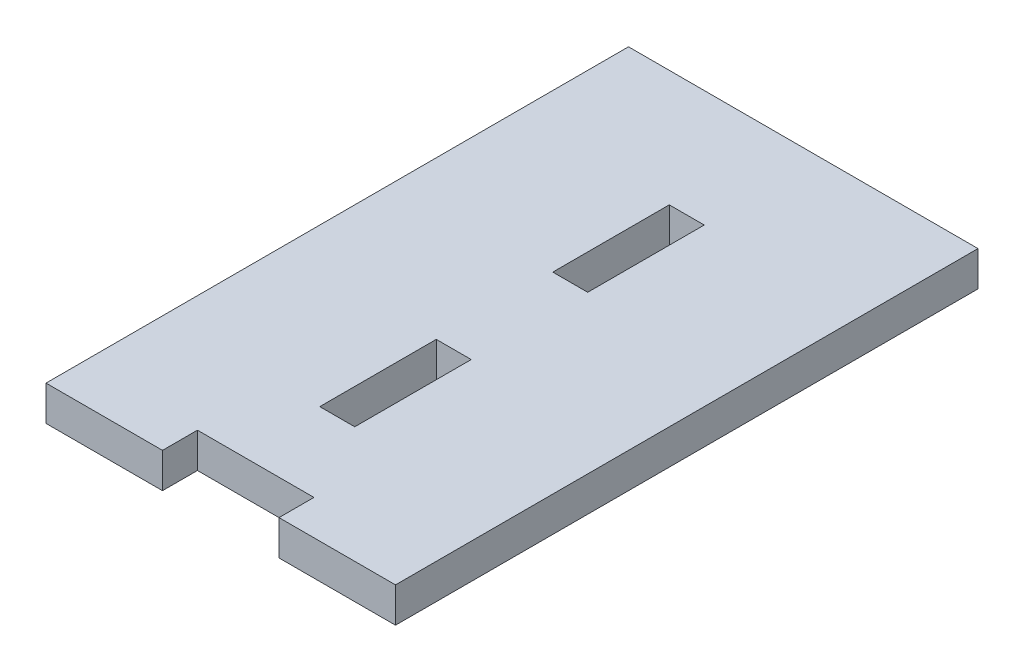
ISO-10303-21;
HEADER;
FILE_DESCRIPTION(('STEP AP214'),'2;1');
FILE_NAME('part.step','',(''),(''),'','','');
FILE_SCHEMA(('AUTOMOTIVE_DESIGN { 1 0 10303 214 1 1 1 1 }'));
ENDSEC;
DATA;
#1=APPLICATION_CONTEXT('core data for automotive mechanical design processes');
#2=APPLICATION_PROTOCOL_DEFINITION('international standard','automotive_design',2000,#1);
#3=PRODUCT_CONTEXT('',#1,'mechanical');
#4=PRODUCT('Part','Part','',(#3));
#5=PRODUCT_RELATED_PRODUCT_CATEGORY('part','',(#4));
#6=PRODUCT_DEFINITION_FORMATION('','',#4);
#7=PRODUCT_DEFINITION_CONTEXT('part definition',#1,'design');
#8=PRODUCT_DEFINITION('design','',#6,#7);
#9=PRODUCT_DEFINITION_SHAPE('','',#8);
#10=(LENGTH_UNIT() NAMED_UNIT(*) SI_UNIT(.MILLI.,.METRE.));
#11=(NAMED_UNIT(*) PLANE_ANGLE_UNIT() SI_UNIT($,.RADIAN.));
#12=(NAMED_UNIT(*) SI_UNIT($,.STERADIAN.) SOLID_ANGLE_UNIT());
#13=UNCERTAINTY_MEASURE_WITH_UNIT(LENGTH_MEASURE(1.E-05),#10,'distance_accuracy_value','');
#14=(GEOMETRIC_REPRESENTATION_CONTEXT(3) GLOBAL_UNCERTAINTY_ASSIGNED_CONTEXT((#13)) GLOBAL_UNIT_ASSIGNED_CONTEXT((#10,
#11,#12)) REPRESENTATION_CONTEXT('',''));
#15=CARTESIAN_POINT('',(0.,0.,0.));
#16=DIRECTION('',(0.,0.,1.));
#17=DIRECTION('',(1.,0.,0.));
#18=AXIS2_PLACEMENT_3D('',#15,#16,#17);
#19=CARTESIAN_POINT('',(0.,3.,0.));
#20=DIRECTION('',(0.,-1.,0.));
#21=DIRECTION('',(0.,0.,-1.));
#22=AXIS2_PLACEMENT_3D('',#19,#20,#21);
#23=PLANE('',#22);
#24=DIRECTION('',(0.,0.,-1.));
#25=VECTOR('',#24,1.);
#26=CARTESIAN_POINT('',(21.5,3.,-10.));
#27=LINE('',#26,#25);
#28=CARTESIAN_POINT('',(21.5,3.,-10.));
#29=VERTEX_POINT('',#28);
#30=CARTESIAN_POINT('',(21.5,3.,-20.));
#31=VERTEX_POINT('',#30);
#32=EDGE_CURVE('E182',#29,#31,#27,.T.);
#33=ORIENTED_EDGE('',*,*,#32,.F.);
#34=DIRECTION('',(1.,0.,0.));
#35=VECTOR('',#34,1.);
#36=CARTESIAN_POINT('',(18.5,3.,-10.));
#37=LINE('',#36,#35);
#38=CARTESIAN_POINT('',(18.5,3.,-10.));
#39=VERTEX_POINT('',#38);
#40=EDGE_CURVE('E190',#39,#29,#37,.T.);
#41=ORIENTED_EDGE('',*,*,#40,.F.);
#42=DIRECTION('',(0.,0.,1.));
#43=VECTOR('',#42,1.);
#44=CARTESIAN_POINT('',(18.5,3.,-10.));
#45=LINE('',#44,#43);
#46=CARTESIAN_POINT('',(18.5,3.,-20.));
#47=VERTEX_POINT('',#46);
#48=EDGE_CURVE('E187',#47,#39,#45,.T.);
#49=ORIENTED_EDGE('',*,*,#48,.F.);
#50=DIRECTION('',(-1.,0.,0.));
#51=VECTOR('',#50,1.);
#52=CARTESIAN_POINT('',(21.5,3.,-20.));
#53=LINE('',#52,#51);
#54=EDGE_CURVE('E184',#31,#47,#53,.T.);
#55=ORIENTED_EDGE('',*,*,#54,.F.);
#56=EDGE_LOOP('',(#33,#41,#49,#55));
#57=FACE_BOUND('',#56,.T.);
#58=DIRECTION('',(1.,0.,0.));
#59=VECTOR('',#58,1.);
#60=CARTESIAN_POINT('',(15.,3.,-3.));
#61=LINE('',#60,#59);
#62=CARTESIAN_POINT('',(15.,3.,-3.));
#63=VERTEX_POINT('',#62);
#64=CARTESIAN_POINT('',(25.,3.,-3.));
#65=VERTEX_POINT('',#64);
#66=EDGE_CURVE('E213',#63,#65,#61,.T.);
#67=ORIENTED_EDGE('',*,*,#66,.T.);
#68=DIRECTION('',(0.,0.,1.));
#69=VECTOR('',#68,1.);
#70=CARTESIAN_POINT('',(25.,3.,-3.));
#71=LINE('',#70,#69);
#72=CARTESIAN_POINT('',(25.,3.,0.));
#73=VERTEX_POINT('',#72);
#74=EDGE_CURVE('E216',#65,#73,#71,.T.);
#75=ORIENTED_EDGE('',*,*,#74,.T.);
#76=DIRECTION('',(1.,0.,0.));
#77=VECTOR('',#76,1.);
#78=CARTESIAN_POINT('',(25.,3.,0.));
#79=LINE('',#78,#77);
#80=CARTESIAN_POINT('',(35.,3.,0.));
#81=VERTEX_POINT('',#80);
#82=EDGE_CURVE('E219',#73,#81,#79,.T.);
#83=ORIENTED_EDGE('',*,*,#82,.T.);
#84=DIRECTION('',(0.,0.,-1.));
#85=VECTOR('',#84,1.);
#86=CARTESIAN_POINT('',(35.,3.,0.));
#87=LINE('',#86,#85);
#88=CARTESIAN_POINT('',(35.,3.,-50.));
#89=VERTEX_POINT('',#88);
#90=EDGE_CURVE('E221',#81,#89,#87,.T.);
#91=ORIENTED_EDGE('',*,*,#90,.T.);
#92=DIRECTION('',(-1.,0.,0.));
#93=VECTOR('',#92,1.);
#94=CARTESIAN_POINT('',(35.,3.,-50.));
#95=LINE('',#94,#93);
#96=CARTESIAN_POINT('',(5.,3.,-50.));
#97=VERTEX_POINT('',#96);
#98=EDGE_CURVE('E223',#89,#97,#95,.T.);
#99=ORIENTED_EDGE('',*,*,#98,.T.);
#100=DIRECTION('',(0.,0.,1.));
#101=VECTOR('',#100,1.);
#102=CARTESIAN_POINT('',(5.,3.,0.));
#103=LINE('',#102,#101);
#104=CARTESIAN_POINT('',(5.,3.,0.));
#105=VERTEX_POINT('',#104);
#106=EDGE_CURVE('E225',#97,#105,#103,.T.);
#107=ORIENTED_EDGE('',*,*,#106,.T.);
#108=DIRECTION('',(1.,0.,0.));
#109=VECTOR('',#108,1.);
#110=CARTESIAN_POINT('',(15.,3.,0.));
#111=LINE('',#110,#109);
#112=CARTESIAN_POINT('',(15.,3.,0.));
#113=VERTEX_POINT('',#112);
#114=EDGE_CURVE('E227',#105,#113,#111,.T.);
#115=ORIENTED_EDGE('',*,*,#114,.T.);
#116=DIRECTION('',(0.,0.,-1.));
#117=VECTOR('',#116,1.);
#118=CARTESIAN_POINT('',(15.,3.,-3.));
#119=LINE('',#118,#117);
#120=EDGE_CURVE('E229',#113,#63,#119,.T.);
#121=ORIENTED_EDGE('',*,*,#120,.T.);
#122=EDGE_LOOP('',(#67,#75,#83,#91,#99,#107,#115,#121));
#123=FACE_BOUND('',#122,.T.);
#124=DIRECTION('',(0.,0.,-1.));
#125=VECTOR('',#124,1.);
#126=CARTESIAN_POINT('',(21.5,3.,-40.));
#127=LINE('',#126,#125);
#128=CARTESIAN_POINT('',(21.5,3.,-30.));
#129=VERTEX_POINT('',#128);
#130=CARTESIAN_POINT('',(21.5,3.,-40.));
#131=VERTEX_POINT('',#130);
#132=EDGE_CURVE('E146',#129,#131,#127,.T.);
#133=ORIENTED_EDGE('',*,*,#132,.F.);
#134=DIRECTION('',(1.,0.,0.));
#135=VECTOR('',#134,1.);
#136=CARTESIAN_POINT('',(21.5,3.,-30.));
#137=LINE('',#136,#135);
#138=CARTESIAN_POINT('',(18.5,3.,-30.));
#139=VERTEX_POINT('',#138);
#140=EDGE_CURVE('E168',#139,#129,#137,.T.);
#141=ORIENTED_EDGE('',*,*,#140,.F.);
#142=DIRECTION('',(0.,0.,1.));
#143=VECTOR('',#142,1.);
#144=CARTESIAN_POINT('',(18.5,3.,-40.));
#145=LINE('',#144,#143);
#146=CARTESIAN_POINT('',(18.5,3.,-40.));
#147=VERTEX_POINT('',#146);
#148=EDGE_CURVE('E166',#147,#139,#145,.T.);
#149=ORIENTED_EDGE('',*,*,#148,.F.);
#150=DIRECTION('',(-1.,0.,0.));
#151=VECTOR('',#150,1.);
#152=CARTESIAN_POINT('',(18.5,3.,-40.));
#153=LINE('',#152,#151);
#154=EDGE_CURVE('E154',#131,#147,#153,.T.);
#155=ORIENTED_EDGE('',*,*,#154,.F.);
#156=EDGE_LOOP('',(#133,#141,#149,#155));
#157=FACE_BOUND('',#156,.T.);
#158=ADVANCED_FACE('F33',(#57,#123,#157),#23,.F.);
#159=CARTESIAN_POINT('',(0.,0.,0.));
#160=DIRECTION('',(0.,-1.,0.));
#161=DIRECTION('',(0.,0.,-1.));
#162=AXIS2_PLACEMENT_3D('',#159,#160,#161);
#163=PLANE('',#162);
#164=DIRECTION('',(1.,0.,0.));
#165=VECTOR('',#164,1.);
#166=CARTESIAN_POINT('',(15.,0.,-3.));
#167=LINE('',#166,#165);
#168=CARTESIAN_POINT('',(15.,0.,-3.));
#169=VERTEX_POINT('',#168);
#170=CARTESIAN_POINT('',(25.,0.,-3.));
#171=VERTEX_POINT('',#170);
#172=EDGE_CURVE('E212',#169,#171,#167,.T.);
#173=ORIENTED_EDGE('',*,*,#172,.F.);
#174=DIRECTION('',(0.,0.,-1.));
#175=VECTOR('',#174,1.);
#176=CARTESIAN_POINT('',(15.,0.,-3.));
#177=LINE('',#176,#175);
#178=CARTESIAN_POINT('',(15.,0.,0.));
#179=VERTEX_POINT('',#178);
#180=EDGE_CURVE('E217',#179,#169,#177,.T.);
#181=ORIENTED_EDGE('',*,*,#180,.F.);
#182=DIRECTION('',(1.,0.,0.));
#183=VECTOR('',#182,1.);
#184=CARTESIAN_POINT('',(15.,0.,0.));
#185=LINE('',#184,#183);
#186=CARTESIAN_POINT('',(5.,0.,0.));
#187=VERTEX_POINT('',#186);
#188=EDGE_CURVE('E244',#187,#179,#185,.T.);
#189=ORIENTED_EDGE('',*,*,#188,.F.);
#190=DIRECTION('',(0.,0.,1.));
#191=VECTOR('',#190,1.);
#192=CARTESIAN_POINT('',(5.,0.,0.));
#193=LINE('',#192,#191);
#194=CARTESIAN_POINT('',(5.,0.,-50.));
#195=VERTEX_POINT('',#194);
#196=EDGE_CURVE('E242',#195,#187,#193,.T.);
#197=ORIENTED_EDGE('',*,*,#196,.F.);
#198=DIRECTION('',(-1.,0.,0.));
#199=VECTOR('',#198,1.);
#200=CARTESIAN_POINT('',(35.,0.,-50.));
#201=LINE('',#200,#199);
#202=CARTESIAN_POINT('',(35.,0.,-50.));
#203=VERTEX_POINT('',#202);
#204=EDGE_CURVE('E240',#203,#195,#201,.T.);
#205=ORIENTED_EDGE('',*,*,#204,.F.);
#206=DIRECTION('',(0.,0.,-1.));
#207=VECTOR('',#206,1.);
#208=CARTESIAN_POINT('',(35.,0.,0.));
#209=LINE('',#208,#207);
#210=CARTESIAN_POINT('',(35.,0.,0.));
#211=VERTEX_POINT('',#210);
#212=EDGE_CURVE('E238',#211,#203,#209,.T.);
#213=ORIENTED_EDGE('',*,*,#212,.F.);
#214=DIRECTION('',(1.,0.,0.));
#215=VECTOR('',#214,1.);
#216=CARTESIAN_POINT('',(25.,0.,0.));
#217=LINE('',#216,#215);
#218=CARTESIAN_POINT('',(25.,0.,0.));
#219=VERTEX_POINT('',#218);
#220=EDGE_CURVE('E236',#219,#211,#217,.T.);
#221=ORIENTED_EDGE('',*,*,#220,.F.);
#222=DIRECTION('',(0.,0.,1.));
#223=VECTOR('',#222,1.);
#224=CARTESIAN_POINT('',(25.,0.,-3.));
#225=LINE('',#224,#223);
#226=EDGE_CURVE('E234',#171,#219,#225,.T.);
#227=ORIENTED_EDGE('',*,*,#226,.F.);
#228=EDGE_LOOP('',(#173,#181,#189,#197,#205,#213,#221,#227));
#229=FACE_BOUND('',#228,.T.);
#230=DIRECTION('',(1.,0.,0.));
#231=VECTOR('',#230,1.);
#232=CARTESIAN_POINT('',(18.5,0.,-10.));
#233=LINE('',#232,#231);
#234=CARTESIAN_POINT('',(18.5,0.,-10.));
#235=VERTEX_POINT('',#234);
#236=CARTESIAN_POINT('',(21.5,0.,-10.));
#237=VERTEX_POINT('',#236);
#238=EDGE_CURVE('E185',#235,#237,#233,.T.);
#239=ORIENTED_EDGE('',*,*,#238,.T.);
#240=DIRECTION('',(0.,0.,-1.));
#241=VECTOR('',#240,1.);
#242=CARTESIAN_POINT('',(21.5,0.,-10.));
#243=LINE('',#242,#241);
#244=CARTESIAN_POINT('',(21.5,0.,-20.));
#245=VERTEX_POINT('',#244);
#246=EDGE_CURVE('E162',#237,#245,#243,.T.);
#247=ORIENTED_EDGE('',*,*,#246,.T.);
#248=DIRECTION('',(-1.,0.,0.));
#249=VECTOR('',#248,1.);
#250=CARTESIAN_POINT('',(21.5,0.,-20.));
#251=LINE('',#250,#249);
#252=CARTESIAN_POINT('',(18.5,0.,-20.));
#253=VERTEX_POINT('',#252);
#254=EDGE_CURVE('E195',#245,#253,#251,.T.);
#255=ORIENTED_EDGE('',*,*,#254,.T.);
#256=DIRECTION('',(0.,0.,1.));
#257=VECTOR('',#256,1.);
#258=CARTESIAN_POINT('',(18.5,0.,-10.));
#259=LINE('',#258,#257);
#260=EDGE_CURVE('E198',#253,#235,#259,.T.);
#261=ORIENTED_EDGE('',*,*,#260,.T.);
#262=EDGE_LOOP('',(#239,#247,#255,#261));
#263=FACE_BOUND('',#262,.T.);
#264=DIRECTION('',(1.,0.,0.));
#265=VECTOR('',#264,1.);
#266=CARTESIAN_POINT('',(21.5,0.,-30.));
#267=LINE('',#266,#265);
#268=CARTESIAN_POINT('',(18.5,0.,-30.));
#269=VERTEX_POINT('',#268);
#270=CARTESIAN_POINT('',(21.5,0.,-30.));
#271=VERTEX_POINT('',#270);
#272=EDGE_CURVE('E155',#269,#271,#267,.T.);
#273=ORIENTED_EDGE('',*,*,#272,.T.);
#274=DIRECTION('',(0.,0.,-1.));
#275=VECTOR('',#274,1.);
#276=CARTESIAN_POINT('',(21.5,0.,-40.));
#277=LINE('',#276,#275);
#278=CARTESIAN_POINT('',(21.5,0.,-40.));
#279=VERTEX_POINT('',#278);
#280=EDGE_CURVE('E56',#271,#279,#277,.T.);
#281=ORIENTED_EDGE('',*,*,#280,.T.);
#282=DIRECTION('',(-1.,0.,0.));
#283=VECTOR('',#282,1.);
#284=CARTESIAN_POINT('',(18.5,0.,-40.));
#285=LINE('',#284,#283);
#286=CARTESIAN_POINT('',(18.5,0.,-40.));
#287=VERTEX_POINT('',#286);
#288=EDGE_CURVE('E161',#279,#287,#285,.T.);
#289=ORIENTED_EDGE('',*,*,#288,.T.);
#290=DIRECTION('',(0.,0.,1.));
#291=VECTOR('',#290,1.);
#292=CARTESIAN_POINT('',(18.5,0.,-40.));
#293=LINE('',#292,#291);
#294=EDGE_CURVE('E174',#287,#269,#293,.T.);
#295=ORIENTED_EDGE('',*,*,#294,.T.);
#296=EDGE_LOOP('',(#273,#281,#289,#295));
#297=FACE_BOUND('',#296,.T.);
#298=ADVANCED_FACE('F274',(#229,#263,#297),#163,.T.);
#299=CARTESIAN_POINT('',(15.,3.,-3.));
#300=DIRECTION('',(0.,0.,-1.));
#301=DIRECTION('',(-1.,0.,0.));
#302=AXIS2_PLACEMENT_3D('',#299,#300,#301);
#303=PLANE('',#302);
#304=ORIENTED_EDGE('',*,*,#172,.T.);
#305=DIRECTION('',(0.,-1.,0.));
#306=VECTOR('',#305,1.);
#307=CARTESIAN_POINT('',(25.,3.,-3.));
#308=LINE('',#307,#306);
#309=EDGE_CURVE('E11',#65,#171,#308,.T.);
#310=ORIENTED_EDGE('',*,*,#309,.F.);
#311=ORIENTED_EDGE('',*,*,#66,.F.);
#312=DIRECTION('',(0.,-1.,0.));
#313=VECTOR('',#312,1.);
#314=CARTESIAN_POINT('',(15.,3.,-3.));
#315=LINE('',#314,#313);
#316=EDGE_CURVE('E231',#63,#169,#315,.T.);
#317=ORIENTED_EDGE('',*,*,#316,.T.);
#318=EDGE_LOOP('',(#304,#310,#311,#317));
#319=FACE_BOUND('',#318,.T.);
#320=ADVANCED_FACE('F35',(#319),#303,.F.);
#321=CARTESIAN_POINT('',(25.,3.,-3.));
#322=DIRECTION('',(1.,0.,0.));
#323=DIRECTION('',(0.,0.,-1.));
#324=AXIS2_PLACEMENT_3D('',#321,#322,#323);
#325=PLANE('',#324);
#326=ORIENTED_EDGE('',*,*,#226,.T.);
#327=DIRECTION('',(0.,-1.,0.));
#328=VECTOR('',#327,1.);
#329=CARTESIAN_POINT('',(25.,3.,0.));
#330=LINE('',#329,#328);
#331=EDGE_CURVE('E41',#73,#219,#330,.T.);
#332=ORIENTED_EDGE('',*,*,#331,.F.);
#333=ORIENTED_EDGE('',*,*,#74,.F.);
#334=ORIENTED_EDGE('',*,*,#309,.T.);
#335=EDGE_LOOP('',(#326,#332,#333,#334));
#336=FACE_BOUND('',#335,.T.);
#337=ADVANCED_FACE('F291',(#336),#325,.F.);
#338=CARTESIAN_POINT('',(25.,3.,0.));
#339=DIRECTION('',(0.,0.,-1.));
#340=DIRECTION('',(-1.,0.,0.));
#341=AXIS2_PLACEMENT_3D('',#338,#339,#340);
#342=PLANE('',#341);
#343=ORIENTED_EDGE('',*,*,#220,.T.);
#344=DIRECTION('',(0.,-1.,0.));
#345=VECTOR('',#344,1.);
#346=CARTESIAN_POINT('',(35.,3.,0.));
#347=LINE('',#346,#345);
#348=EDGE_CURVE('E261',#81,#211,#347,.T.);
#349=ORIENTED_EDGE('',*,*,#348,.F.);
#350=ORIENTED_EDGE('',*,*,#82,.F.);
#351=ORIENTED_EDGE('',*,*,#331,.T.);
#352=EDGE_LOOP('',(#343,#349,#350,#351));
#353=FACE_BOUND('',#352,.T.);
#354=ADVANCED_FACE('F268',(#353),#342,.F.);
#355=CARTESIAN_POINT('',(35.,3.,0.));
#356=DIRECTION('',(-1.,0.,0.));
#357=DIRECTION('',(0.,0.,1.));
#358=AXIS2_PLACEMENT_3D('',#355,#356,#357);
#359=PLANE('',#358);
#360=ORIENTED_EDGE('',*,*,#212,.T.);
#361=DIRECTION('',(0.,-1.,0.));
#362=VECTOR('',#361,1.);
#363=CARTESIAN_POINT('',(35.,3.,-50.));
#364=LINE('',#363,#362);
#365=EDGE_CURVE('E258',#89,#203,#364,.T.);
#366=ORIENTED_EDGE('',*,*,#365,.F.);
#367=ORIENTED_EDGE('',*,*,#90,.F.);
#368=ORIENTED_EDGE('',*,*,#348,.T.);
#369=EDGE_LOOP('',(#360,#366,#367,#368));
#370=FACE_BOUND('',#369,.T.);
#371=ADVANCED_FACE('F280',(#370),#359,.F.);
#372=CARTESIAN_POINT('',(35.,3.,-50.));
#373=DIRECTION('',(0.,0.,1.));
#374=DIRECTION('',(1.,0.,0.));
#375=AXIS2_PLACEMENT_3D('',#372,#373,#374);
#376=PLANE('',#375);
#377=ORIENTED_EDGE('',*,*,#204,.T.);
#378=DIRECTION('',(0.,-1.,0.));
#379=VECTOR('',#378,1.);
#380=CARTESIAN_POINT('',(5.,3.,-50.));
#381=LINE('',#380,#379);
#382=EDGE_CURVE('E255',#97,#195,#381,.T.);
#383=ORIENTED_EDGE('',*,*,#382,.F.);
#384=ORIENTED_EDGE('',*,*,#98,.F.);
#385=ORIENTED_EDGE('',*,*,#365,.T.);
#386=EDGE_LOOP('',(#377,#383,#384,#385));
#387=FACE_BOUND('',#386,.T.);
#388=ADVANCED_FACE('F284',(#387),#376,.F.);
#389=CARTESIAN_POINT('',(5.,3.,0.));
#390=DIRECTION('',(1.,0.,0.));
#391=DIRECTION('',(0.,0.,-1.));
#392=AXIS2_PLACEMENT_3D('',#389,#390,#391);
#393=PLANE('',#392);
#394=ORIENTED_EDGE('',*,*,#196,.T.);
#395=DIRECTION('',(0.,-1.,0.));
#396=VECTOR('',#395,1.);
#397=CARTESIAN_POINT('',(5.,3.,0.));
#398=LINE('',#397,#396);
#399=EDGE_CURVE('E252',#105,#187,#398,.T.);
#400=ORIENTED_EDGE('',*,*,#399,.F.);
#401=ORIENTED_EDGE('',*,*,#106,.F.);
#402=ORIENTED_EDGE('',*,*,#382,.T.);
#403=EDGE_LOOP('',(#394,#400,#401,#402));
#404=FACE_BOUND('',#403,.T.);
#405=ADVANCED_FACE('F304',(#404),#393,.F.);
#406=CARTESIAN_POINT('',(15.,3.,0.));
#407=DIRECTION('',(0.,0.,-1.));
#408=DIRECTION('',(-1.,0.,0.));
#409=AXIS2_PLACEMENT_3D('',#406,#407,#408);
#410=PLANE('',#409);
#411=ORIENTED_EDGE('',*,*,#188,.T.);
#412=DIRECTION('',(0.,-1.,0.));
#413=VECTOR('',#412,1.);
#414=CARTESIAN_POINT('',(15.,3.,0.));
#415=LINE('',#414,#413);
#416=EDGE_CURVE('E249',#113,#179,#415,.T.);
#417=ORIENTED_EDGE('',*,*,#416,.F.);
#418=ORIENTED_EDGE('',*,*,#114,.F.);
#419=ORIENTED_EDGE('',*,*,#399,.T.);
#420=EDGE_LOOP('',(#411,#417,#418,#419));
#421=FACE_BOUND('',#420,.T.);
#422=ADVANCED_FACE('F302',(#421),#410,.F.);
#423=CARTESIAN_POINT('',(15.,3.,-3.));
#424=DIRECTION('',(-1.,0.,0.));
#425=DIRECTION('',(0.,0.,1.));
#426=AXIS2_PLACEMENT_3D('',#423,#424,#425);
#427=PLANE('',#426);
#428=ORIENTED_EDGE('',*,*,#180,.T.);
#429=ORIENTED_EDGE('',*,*,#316,.F.);
#430=ORIENTED_EDGE('',*,*,#120,.F.);
#431=ORIENTED_EDGE('',*,*,#416,.T.);
#432=EDGE_LOOP('',(#428,#429,#430,#431));
#433=FACE_BOUND('',#432,.T.);
#434=ADVANCED_FACE('F297',(#433),#427,.F.);
#435=CARTESIAN_POINT('',(21.5,3.,-10.));
#436=DIRECTION('',(-1.,0.,0.));
#437=DIRECTION('',(0.,0.,1.));
#438=AXIS2_PLACEMENT_3D('',#435,#436,#437);
#439=PLANE('',#438);
#440=ORIENTED_EDGE('',*,*,#246,.F.);
#441=DIRECTION('',(0.,-1.,0.));
#442=VECTOR('',#441,1.);
#443=CARTESIAN_POINT('',(21.5,3.,-10.));
#444=LINE('',#443,#442);
#445=EDGE_CURVE('E192',#29,#237,#444,.T.);
#446=ORIENTED_EDGE('',*,*,#445,.F.);
#447=ORIENTED_EDGE('',*,*,#32,.T.);
#448=DIRECTION('',(0.,-1.,0.));
#449=VECTOR('',#448,1.);
#450=CARTESIAN_POINT('',(21.5,3.,-20.));
#451=LINE('',#450,#449);
#452=EDGE_CURVE('E209',#31,#245,#451,.T.);
#453=ORIENTED_EDGE('',*,*,#452,.T.);
#454=EDGE_LOOP('',(#440,#446,#447,#453));
#455=FACE_BOUND('',#454,.T.);
#456=ADVANCED_FACE('F322',(#455),#439,.T.);
#457=CARTESIAN_POINT('',(21.5,3.,-20.));
#458=DIRECTION('',(0.,0.,1.));
#459=DIRECTION('',(1.,0.,0.));
#460=AXIS2_PLACEMENT_3D('',#457,#458,#459);
#461=PLANE('',#460);
#462=ORIENTED_EDGE('',*,*,#254,.F.);
#463=ORIENTED_EDGE('',*,*,#452,.F.);
#464=ORIENTED_EDGE('',*,*,#54,.T.);
#465=DIRECTION('',(0.,-1.,0.));
#466=VECTOR('',#465,1.);
#467=CARTESIAN_POINT('',(18.5,3.,-20.));
#468=LINE('',#467,#466);
#469=EDGE_CURVE('E207',#47,#253,#468,.T.);
#470=ORIENTED_EDGE('',*,*,#469,.T.);
#471=EDGE_LOOP('',(#462,#463,#464,#470));
#472=FACE_BOUND('',#471,.T.);
#473=ADVANCED_FACE('F329',(#472),#461,.T.);
#474=CARTESIAN_POINT('',(18.5,3.,-10.));
#475=DIRECTION('',(1.,0.,0.));
#476=DIRECTION('',(0.,0.,-1.));
#477=AXIS2_PLACEMENT_3D('',#474,#475,#476);
#478=PLANE('',#477);
#479=ORIENTED_EDGE('',*,*,#260,.F.);
#480=ORIENTED_EDGE('',*,*,#469,.F.);
#481=ORIENTED_EDGE('',*,*,#48,.T.);
#482=DIRECTION('',(0.,-1.,0.));
#483=VECTOR('',#482,1.);
#484=CARTESIAN_POINT('',(18.5,3.,-10.));
#485=LINE('',#484,#483);
#486=EDGE_CURVE('E205',#39,#235,#485,.T.);
#487=ORIENTED_EDGE('',*,*,#486,.T.);
#488=EDGE_LOOP('',(#479,#480,#481,#487));
#489=FACE_BOUND('',#488,.T.);
#490=ADVANCED_FACE('F334',(#489),#478,.T.);
#491=CARTESIAN_POINT('',(18.5,3.,-10.));
#492=DIRECTION('',(0.,0.,-1.));
#493=DIRECTION('',(-1.,0.,0.));
#494=AXIS2_PLACEMENT_3D('',#491,#492,#493);
#495=PLANE('',#494);
#496=ORIENTED_EDGE('',*,*,#238,.F.);
#497=ORIENTED_EDGE('',*,*,#486,.F.);
#498=ORIENTED_EDGE('',*,*,#40,.T.);
#499=ORIENTED_EDGE('',*,*,#445,.T.);
#500=EDGE_LOOP('',(#496,#497,#498,#499));
#501=FACE_BOUND('',#500,.T.);
#502=ADVANCED_FACE('F340',(#501),#495,.T.);
#503=CARTESIAN_POINT('',(21.5,3.,-40.));
#504=DIRECTION('',(-1.,0.,0.));
#505=DIRECTION('',(0.,0.,1.));
#506=AXIS2_PLACEMENT_3D('',#503,#504,#505);
#507=PLANE('',#506);
#508=ORIENTED_EDGE('',*,*,#280,.F.);
#509=DIRECTION('',(0.,-1.,0.));
#510=VECTOR('',#509,1.);
#511=CARTESIAN_POINT('',(21.5,3.,-30.));
#512=LINE('',#511,#510);
#513=EDGE_CURVE('E150',#129,#271,#512,.T.);
#514=ORIENTED_EDGE('',*,*,#513,.F.);
#515=ORIENTED_EDGE('',*,*,#132,.T.);
#516=DIRECTION('',(0.,-1.,0.));
#517=VECTOR('',#516,1.);
#518=CARTESIAN_POINT('',(21.5,3.,-40.));
#519=LINE('',#518,#517);
#520=EDGE_CURVE('E149',#131,#279,#519,.T.);
#521=ORIENTED_EDGE('',*,*,#520,.T.);
#522=EDGE_LOOP('',(#508,#514,#515,#521));
#523=FACE_BOUND('',#522,.T.);
#524=ADVANCED_FACE('F148',(#523),#507,.T.);
#525=CARTESIAN_POINT('',(18.5,3.,-40.));
#526=DIRECTION('',(0.,0.,1.));
#527=DIRECTION('',(1.,0.,0.));
#528=AXIS2_PLACEMENT_3D('',#525,#526,#527);
#529=PLANE('',#528);
#530=ORIENTED_EDGE('',*,*,#288,.F.);
#531=ORIENTED_EDGE('',*,*,#520,.F.);
#532=ORIENTED_EDGE('',*,*,#154,.T.);
#533=DIRECTION('',(0.,-1.,0.));
#534=VECTOR('',#533,1.);
#535=CARTESIAN_POINT('',(18.5,3.,-40.));
#536=LINE('',#535,#534);
#537=EDGE_CURVE('E163',#147,#287,#536,.T.);
#538=ORIENTED_EDGE('',*,*,#537,.T.);
#539=EDGE_LOOP('',(#530,#531,#532,#538));
#540=FACE_BOUND('',#539,.T.);
#541=ADVANCED_FACE('F158',(#540),#529,.T.);
#542=CARTESIAN_POINT('',(18.5,3.,-40.));
#543=DIRECTION('',(1.,0.,0.));
#544=DIRECTION('',(0.,0.,-1.));
#545=AXIS2_PLACEMENT_3D('',#542,#543,#544);
#546=PLANE('',#545);
#547=ORIENTED_EDGE('',*,*,#294,.F.);
#548=ORIENTED_EDGE('',*,*,#537,.F.);
#549=ORIENTED_EDGE('',*,*,#148,.T.);
#550=DIRECTION('',(0.,-1.,0.));
#551=VECTOR('',#550,1.);
#552=CARTESIAN_POINT('',(18.5,3.,-30.));
#553=LINE('',#552,#551);
#554=EDGE_CURVE('E48',#139,#269,#553,.T.);
#555=ORIENTED_EDGE('',*,*,#554,.T.);
#556=EDGE_LOOP('',(#547,#548,#549,#555));
#557=FACE_BOUND('',#556,.T.);
#558=ADVANCED_FACE('F359',(#557),#546,.T.);
#559=CARTESIAN_POINT('',(21.5,3.,-30.));
#560=DIRECTION('',(0.,0.,-1.));
#561=DIRECTION('',(-1.,0.,0.));
#562=AXIS2_PLACEMENT_3D('',#559,#560,#561);
#563=PLANE('',#562);
#564=ORIENTED_EDGE('',*,*,#272,.F.);
#565=ORIENTED_EDGE('',*,*,#554,.F.);
#566=ORIENTED_EDGE('',*,*,#140,.T.);
#567=ORIENTED_EDGE('',*,*,#513,.T.);
#568=EDGE_LOOP('',(#564,#565,#566,#567));
#569=FACE_BOUND('',#568,.T.);
#570=ADVANCED_FACE('F362',(#569),#563,.T.);
#571=CLOSED_SHELL('',(#158,#298,#320,#337,#354,#371,#388,#405,#422,#434,#456,#473,#490,#502,
#524,#541,#558,#570));
#572=MANIFOLD_SOLID_BREP('B2',#571);
#573=ADVANCED_BREP_SHAPE_REPRESENTATION('',(#18,#572),#14);
#574=SHAPE_DEFINITION_REPRESENTATION(#9,#573);
ENDSEC;
END-ISO-10303-21;
